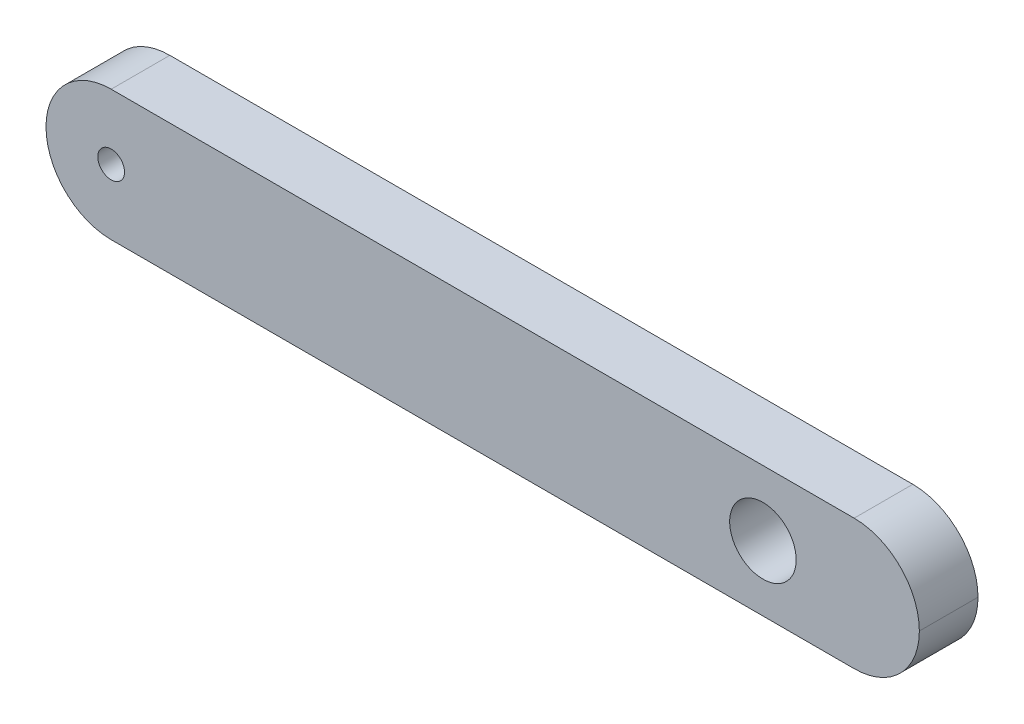
ISO-10303-21;
HEADER;
FILE_DESCRIPTION(('STEP AP214'),'2;1');
FILE_NAME('part.step','',(''),(''),'','','');
FILE_SCHEMA(('AUTOMOTIVE_DESIGN { 1 0 10303 214 1 1 1 1 }'));
ENDSEC;
DATA;
#1=APPLICATION_CONTEXT('core data for automotive mechanical design processes');
#2=APPLICATION_PROTOCOL_DEFINITION('international standard','automotive_design',2000,#1);
#3=PRODUCT_CONTEXT('',#1,'mechanical');
#4=PRODUCT('Part','Part','',(#3));
#5=PRODUCT_RELATED_PRODUCT_CATEGORY('part','',(#4));
#6=PRODUCT_DEFINITION_FORMATION('','',#4);
#7=PRODUCT_DEFINITION_CONTEXT('part definition',#1,'design');
#8=PRODUCT_DEFINITION('design','',#6,#7);
#9=PRODUCT_DEFINITION_SHAPE('','',#8);
#10=(LENGTH_UNIT() NAMED_UNIT(*) SI_UNIT(.MILLI.,.METRE.));
#11=(NAMED_UNIT(*) PLANE_ANGLE_UNIT() SI_UNIT($,.RADIAN.));
#12=(NAMED_UNIT(*) SI_UNIT($,.STERADIAN.) SOLID_ANGLE_UNIT());
#13=UNCERTAINTY_MEASURE_WITH_UNIT(LENGTH_MEASURE(1.E-05),#10,'distance_accuracy_value','');
#14=(GEOMETRIC_REPRESENTATION_CONTEXT(3) GLOBAL_UNCERTAINTY_ASSIGNED_CONTEXT((#13)) GLOBAL_UNIT_ASSIGNED_CONTEXT((#10,
#11,#12)) REPRESENTATION_CONTEXT('',''));
#15=CARTESIAN_POINT('',(0.,0.,0.));
#16=DIRECTION('',(0.,0.,1.));
#17=DIRECTION('',(1.,0.,0.));
#18=AXIS2_PLACEMENT_3D('',#15,#16,#17);
#19=CARTESIAN_POINT('',(0.,0.,4.5));
#20=DIRECTION('',(0.,0.,1.));
#21=DIRECTION('',(1.,0.,0.));
#22=AXIS2_PLACEMENT_3D('',#19,#20,#21);
#23=PLANE('',#22);
#24=CARTESIAN_POINT('',(5.,-5.,4.5));
#25=DIRECTION('',(0.,0.,1.));
#26=DIRECTION('',(1.,0.,0.));
#27=AXIS2_PLACEMENT_3D('',#24,#25,#26);
#28=CIRCLE('',#27,1.025);
#29=CARTESIAN_POINT('',(6.025,-5.,4.5));
#30=VERTEX_POINT('',#29);
#31=EDGE_CURVE('E150',#30,#30,#28,.T.);
#32=ORIENTED_EDGE('',*,*,#31,.F.);
#33=EDGE_LOOP('',(#32));
#34=FACE_BOUND('',#33,.T.);
#35=DIRECTION('',(1.,0.,0.));
#36=VECTOR('',#35,1.);
#37=CARTESIAN_POINT('',(0.,-10.,4.5));
#38=LINE('',#37,#36);
#39=CARTESIAN_POINT('',(5.,-10.,4.5));
#40=VERTEX_POINT('',#39);
#41=CARTESIAN_POINT('',(62.,-10.,4.5));
#42=VERTEX_POINT('',#41);
#43=EDGE_CURVE('E142',#40,#42,#38,.T.);
#44=ORIENTED_EDGE('',*,*,#43,.T.);
#45=CARTESIAN_POINT('',(62.,-5.,4.5));
#46=DIRECTION('',(0.,0.,1.));
#47=DIRECTION('',(1.,0.,0.));
#48=AXIS2_PLACEMENT_3D('',#45,#46,#47);
#49=CIRCLE('',#48,5.);
#50=CARTESIAN_POINT('',(67.,-5.,4.5));
#51=VERTEX_POINT('',#50);
#52=EDGE_CURVE('E170',#42,#51,#49,.T.);
#53=ORIENTED_EDGE('',*,*,#52,.T.);
#54=CARTESIAN_POINT('',(62.,-5.,4.5));
#55=DIRECTION('',(0.,0.,1.));
#56=DIRECTION('',(1.,0.,0.));
#57=AXIS2_PLACEMENT_3D('',#54,#55,#56);
#58=CIRCLE('',#57,5.);
#59=CARTESIAN_POINT('',(62.,0.,4.5));
#60=VERTEX_POINT('',#59);
#61=EDGE_CURVE('E84',#51,#60,#58,.T.);
#62=ORIENTED_EDGE('',*,*,#61,.T.);
#63=DIRECTION('',(1.,0.,0.));
#64=VECTOR('',#63,1.);
#65=CARTESIAN_POINT('',(0.,0.,4.5));
#66=LINE('',#65,#64);
#67=CARTESIAN_POINT('',(5.,0.,4.5));
#68=VERTEX_POINT('',#67);
#69=EDGE_CURVE('E158',#68,#60,#66,.T.);
#70=ORIENTED_EDGE('',*,*,#69,.F.);
#71=CARTESIAN_POINT('',(5.,-5.,4.5));
#72=DIRECTION('',(0.,0.,1.));
#73=DIRECTION('',(1.,0.,0.));
#74=AXIS2_PLACEMENT_3D('',#71,#72,#73);
#75=CIRCLE('',#74,5.);
#76=CARTESIAN_POINT('',(0.,-5.,4.5));
#77=VERTEX_POINT('',#76);
#78=EDGE_CURVE('E165',#68,#77,#75,.T.);
#79=ORIENTED_EDGE('',*,*,#78,.T.);
#80=CARTESIAN_POINT('',(5.,-5.,4.5));
#81=DIRECTION('',(0.,0.,1.));
#82=DIRECTION('',(1.,0.,0.));
#83=AXIS2_PLACEMENT_3D('',#80,#81,#82);
#84=CIRCLE('',#83,5.);
#85=EDGE_CURVE('E167',#77,#40,#84,.T.);
#86=ORIENTED_EDGE('',*,*,#85,.T.);
#87=EDGE_LOOP('',(#44,#53,#62,#70,#79,#86));
#88=FACE_BOUND('',#87,.T.);
#89=CARTESIAN_POINT('',(55.,-5.,4.5));
#90=DIRECTION('',(0.,0.,1.));
#91=DIRECTION('',(1.,0.,0.));
#92=AXIS2_PLACEMENT_3D('',#89,#90,#91);
#93=CIRCLE('',#92,2.55);
#94=CARTESIAN_POINT('',(57.55,-5.,4.5));
#95=VERTEX_POINT('',#94);
#96=EDGE_CURVE('E174',#95,#95,#93,.T.);
#97=ORIENTED_EDGE('',*,*,#96,.F.);
#98=EDGE_LOOP('',(#97));
#99=FACE_BOUND('',#98,.T.);
#100=ADVANCED_FACE('F67',(#34,#88,#99),#23,.T.);
#101=CARTESIAN_POINT('',(0.,0.,0.));
#102=DIRECTION('',(0.,0.,1.));
#103=DIRECTION('',(1.,0.,0.));
#104=AXIS2_PLACEMENT_3D('',#101,#102,#103);
#105=PLANE('',#104);
#106=CARTESIAN_POINT('',(62.,-5.,0.));
#107=DIRECTION('',(0.,0.,1.));
#108=DIRECTION('',(1.,0.,0.));
#109=AXIS2_PLACEMENT_3D('',#106,#107,#108);
#110=CIRCLE('',#109,5.);
#111=CARTESIAN_POINT('',(62.,0.,0.));
#112=VERTEX_POINT('',#111);
#113=CARTESIAN_POINT('',(67.,-5.,0.));
#114=VERTEX_POINT('',#113);
#115=EDGE_CURVE('E131',#112,#114,#110,.F.);
#116=ORIENTED_EDGE('',*,*,#115,.T.);
#117=CARTESIAN_POINT('',(62.,-5.,0.));
#118=DIRECTION('',(0.,0.,1.));
#119=DIRECTION('',(1.,0.,0.));
#120=AXIS2_PLACEMENT_3D('',#117,#118,#119);
#121=CIRCLE('',#120,5.);
#122=CARTESIAN_POINT('',(62.,-10.,0.));
#123=VERTEX_POINT('',#122);
#124=EDGE_CURVE('E148',#114,#123,#121,.F.);
#125=ORIENTED_EDGE('',*,*,#124,.T.);
#126=DIRECTION('',(1.,0.,0.));
#127=VECTOR('',#126,1.);
#128=CARTESIAN_POINT('',(0.,-10.,0.));
#129=LINE('',#128,#127);
#130=CARTESIAN_POINT('',(5.,-10.,0.));
#131=VERTEX_POINT('',#130);
#132=EDGE_CURVE('E139',#131,#123,#129,.T.);
#133=ORIENTED_EDGE('',*,*,#132,.F.);
#134=CARTESIAN_POINT('',(5.,-5.,0.));
#135=DIRECTION('',(0.,0.,1.));
#136=DIRECTION('',(1.,0.,0.));
#137=AXIS2_PLACEMENT_3D('',#134,#135,#136);
#138=CIRCLE('',#137,5.);
#139=CARTESIAN_POINT('',(0.,-5.,0.));
#140=VERTEX_POINT('',#139);
#141=EDGE_CURVE('E121',#131,#140,#138,.F.);
#142=ORIENTED_EDGE('',*,*,#141,.T.);
#143=CARTESIAN_POINT('',(5.,-5.,0.));
#144=DIRECTION('',(0.,0.,1.));
#145=DIRECTION('',(1.,0.,0.));
#146=AXIS2_PLACEMENT_3D('',#143,#144,#145);
#147=CIRCLE('',#146,5.);
#148=CARTESIAN_POINT('',(5.,0.,0.));
#149=VERTEX_POINT('',#148);
#150=EDGE_CURVE('E132',#140,#149,#147,.F.);
#151=ORIENTED_EDGE('',*,*,#150,.T.);
#152=DIRECTION('',(1.,0.,0.));
#153=VECTOR('',#152,1.);
#154=CARTESIAN_POINT('',(0.,0.,0.));
#155=LINE('',#154,#153);
#156=EDGE_CURVE('E149',#149,#112,#155,.T.);
#157=ORIENTED_EDGE('',*,*,#156,.T.);
#158=EDGE_LOOP('',(#116,#125,#133,#142,#151,#157));
#159=FACE_BOUND('',#158,.T.);
#160=CARTESIAN_POINT('',(5.,-5.,0.));
#161=DIRECTION('',(0.,0.,1.));
#162=DIRECTION('',(1.,0.,0.));
#163=AXIS2_PLACEMENT_3D('',#160,#161,#162);
#164=CIRCLE('',#163,1.025);
#165=CARTESIAN_POINT('',(6.025,-5.,0.));
#166=VERTEX_POINT('',#165);
#167=EDGE_CURVE('E155',#166,#166,#164,.T.);
#168=ORIENTED_EDGE('',*,*,#167,.T.);
#169=EDGE_LOOP('',(#168));
#170=FACE_BOUND('',#169,.T.);
#171=CARTESIAN_POINT('',(55.,-5.,0.));
#172=DIRECTION('',(0.,0.,1.));
#173=DIRECTION('',(1.,0.,0.));
#174=AXIS2_PLACEMENT_3D('',#171,#172,#173);
#175=CIRCLE('',#174,2.55);
#176=CARTESIAN_POINT('',(57.55,-5.,0.));
#177=VERTEX_POINT('',#176);
#178=EDGE_CURVE('E172',#177,#177,#175,.T.);
#179=ORIENTED_EDGE('',*,*,#178,.T.);
#180=EDGE_LOOP('',(#179));
#181=FACE_BOUND('',#180,.T.);
#182=ADVANCED_FACE('F145',(#159,#170,#181),#105,.F.);
#183=CARTESIAN_POINT('',(0.,-10.,4.5));
#184=DIRECTION('',(0.,1.,0.));
#185=DIRECTION('',(0.,0.,1.));
#186=AXIS2_PLACEMENT_3D('',#183,#184,#185);
#187=PLANE('',#186);
#188=ORIENTED_EDGE('',*,*,#43,.F.);
#189=DIRECTION('',(0.,0.,-1.));
#190=VECTOR('',#189,1.);
#191=CARTESIAN_POINT('',(5.,-10.,4.5));
#192=LINE('',#191,#190);
#193=EDGE_CURVE('E125',#40,#131,#192,.T.);
#194=ORIENTED_EDGE('',*,*,#193,.T.);
#195=ORIENTED_EDGE('',*,*,#132,.T.);
#196=DIRECTION('',(0.,0.,-1.));
#197=VECTOR('',#196,1.);
#198=CARTESIAN_POINT('',(62.,-10.,4.5));
#199=LINE('',#198,#197);
#200=EDGE_CURVE('E143',#123,#42,#199,.F.);
#201=ORIENTED_EDGE('',*,*,#200,.T.);
#202=EDGE_LOOP('',(#188,#194,#195,#201));
#203=FACE_BOUND('',#202,.T.);
#204=ADVANCED_FACE('F137',(#203),#187,.F.);
#205=CARTESIAN_POINT('',(0.,0.,4.5));
#206=DIRECTION('',(0.,1.,0.));
#207=DIRECTION('',(0.,0.,1.));
#208=AXIS2_PLACEMENT_3D('',#205,#206,#207);
#209=PLANE('',#208);
#210=ORIENTED_EDGE('',*,*,#69,.T.);
#211=DIRECTION('',(0.,0.,-1.));
#212=VECTOR('',#211,1.);
#213=CARTESIAN_POINT('',(62.,0.,4.5));
#214=LINE('',#213,#212);
#215=EDGE_CURVE('E12',#60,#112,#214,.T.);
#216=ORIENTED_EDGE('',*,*,#215,.T.);
#217=ORIENTED_EDGE('',*,*,#156,.F.);
#218=DIRECTION('',(0.,0.,-1.));
#219=VECTOR('',#218,1.);
#220=CARTESIAN_POINT('',(5.,0.,4.5));
#221=LINE('',#220,#219);
#222=EDGE_CURVE('E76',#149,#68,#221,.F.);
#223=ORIENTED_EDGE('',*,*,#222,.T.);
#224=EDGE_LOOP('',(#210,#216,#217,#223));
#225=FACE_BOUND('',#224,.T.);
#226=ADVANCED_FACE('F183',(#225),#209,.T.);
#227=CARTESIAN_POINT('',(5.,-5.,4.5));
#228=DIRECTION('',(0.,0.,-1.));
#229=DIRECTION('',(-1.,0.,0.));
#230=AXIS2_PLACEMENT_3D('',#227,#228,#229);
#231=CYLINDRICAL_SURFACE('',#230,1.025);
#232=ORIENTED_EDGE('',*,*,#31,.T.);
#233=EDGE_LOOP('',(#232));
#234=FACE_BOUND('',#233,.T.);
#235=ORIENTED_EDGE('',*,*,#167,.F.);
#236=EDGE_LOOP('',(#235));
#237=FACE_BOUND('',#236,.T.);
#238=ADVANCED_FACE('F205',(#234,#237),#231,.F.);
#239=CARTESIAN_POINT('',(55.,-5.,4.5));
#240=DIRECTION('',(0.,0.,-1.));
#241=DIRECTION('',(-1.,0.,0.));
#242=AXIS2_PLACEMENT_3D('',#239,#240,#241);
#243=CYLINDRICAL_SURFACE('',#242,2.55);
#244=ORIENTED_EDGE('',*,*,#96,.T.);
#245=EDGE_LOOP('',(#244));
#246=FACE_BOUND('',#245,.T.);
#247=ORIENTED_EDGE('',*,*,#178,.F.);
#248=EDGE_LOOP('',(#247));
#249=FACE_BOUND('',#248,.T.);
#250=ADVANCED_FACE('F194',(#246,#249),#243,.F.);
#251=CARTESIAN_POINT('',(5.,-5.,4.5));
#252=DIRECTION('',(0.,0.,1.));
#253=DIRECTION('',(1.,0.,0.));
#254=AXIS2_PLACEMENT_3D('',#251,#252,#253);
#255=CYLINDRICAL_SURFACE('',#254,5.);
#256=DIRECTION('',(0.,0.,-1.));
#257=VECTOR('',#256,1.);
#258=CARTESIAN_POINT('',(0.,-5.,0.));
#259=LINE('',#258,#257);
#260=EDGE_CURVE('E127',#77,#140,#259,.T.);
#261=ORIENTED_EDGE('',*,*,#260,.F.);
#262=ORIENTED_EDGE('',*,*,#78,.F.);
#263=ORIENTED_EDGE('',*,*,#222,.F.);
#264=ORIENTED_EDGE('',*,*,#150,.F.);
#265=EDGE_LOOP('',(#261,#262,#263,#264));
#266=FACE_BOUND('',#265,.T.);
#267=ADVANCED_FACE('F185',(#266),#255,.T.);
#268=CARTESIAN_POINT('',(5.,-5.,4.5));
#269=DIRECTION('',(0.,0.,-1.));
#270=DIRECTION('',(-1.,0.,0.));
#271=AXIS2_PLACEMENT_3D('',#268,#269,#270);
#272=CYLINDRICAL_SURFACE('',#271,5.);
#273=ORIENTED_EDGE('',*,*,#85,.F.);
#274=ORIENTED_EDGE('',*,*,#260,.T.);
#275=ORIENTED_EDGE('',*,*,#141,.F.);
#276=ORIENTED_EDGE('',*,*,#193,.F.);
#277=EDGE_LOOP('',(#273,#274,#275,#276));
#278=FACE_BOUND('',#277,.T.);
#279=ADVANCED_FACE('F124',(#278),#272,.T.);
#280=CARTESIAN_POINT('',(62.,-5.,4.5));
#281=DIRECTION('',(0.,0.,-1.));
#282=DIRECTION('',(-1.,0.,0.));
#283=AXIS2_PLACEMENT_3D('',#280,#281,#282);
#284=CYLINDRICAL_SURFACE('',#283,5.);
#285=ORIENTED_EDGE('',*,*,#215,.F.);
#286=ORIENTED_EDGE('',*,*,#61,.F.);
#287=DIRECTION('',(0.,0.,-1.));
#288=VECTOR('',#287,1.);
#289=CARTESIAN_POINT('',(67.,-5.,4.5));
#290=LINE('',#289,#288);
#291=EDGE_CURVE('E71',#114,#51,#290,.F.);
#292=ORIENTED_EDGE('',*,*,#291,.F.);
#293=ORIENTED_EDGE('',*,*,#115,.F.);
#294=EDGE_LOOP('',(#285,#286,#292,#293));
#295=FACE_BOUND('',#294,.T.);
#296=ADVANCED_FACE('F69',(#295),#284,.T.);
#297=CARTESIAN_POINT('',(62.,-5.,4.5));
#298=DIRECTION('',(0.,0.,1.));
#299=DIRECTION('',(1.,0.,0.));
#300=AXIS2_PLACEMENT_3D('',#297,#298,#299);
#301=CYLINDRICAL_SURFACE('',#300,5.);
#302=ORIENTED_EDGE('',*,*,#52,.F.);
#303=ORIENTED_EDGE('',*,*,#200,.F.);
#304=ORIENTED_EDGE('',*,*,#124,.F.);
#305=ORIENTED_EDGE('',*,*,#291,.T.);
#306=EDGE_LOOP('',(#302,#303,#304,#305));
#307=FACE_BOUND('',#306,.T.);
#308=ADVANCED_FACE('F179',(#307),#301,.T.);
#309=CLOSED_SHELL('',(#100,#182,#204,#226,#238,#250,#267,#279,#296,#308));
#310=MANIFOLD_SOLID_BREP('B2',#309);
#311=ADVANCED_BREP_SHAPE_REPRESENTATION('',(#18,#310),#14);
#312=SHAPE_DEFINITION_REPRESENTATION(#9,#311);
ENDSEC;
END-ISO-10303-21;
